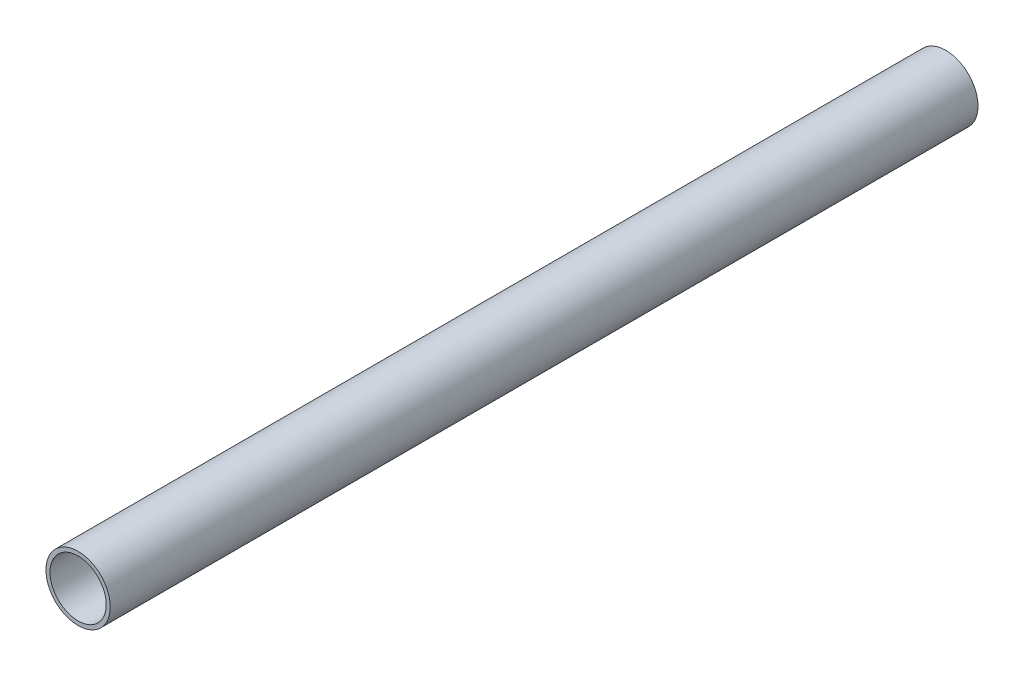
ISO-10303-21;
HEADER;
FILE_DESCRIPTION(('STEP AP214'),'2;1');
FILE_NAME('part.step','',(''),(''),'','','');
FILE_SCHEMA(('AUTOMOTIVE_DESIGN { 1 0 10303 214 1 1 1 1 }'));
ENDSEC;
DATA;
#1=APPLICATION_CONTEXT('core data for automotive mechanical design processes');
#2=APPLICATION_PROTOCOL_DEFINITION('international standard','automotive_design',2000,#1);
#3=PRODUCT_CONTEXT('',#1,'mechanical');
#4=PRODUCT('Part','Part','',(#3));
#5=PRODUCT_RELATED_PRODUCT_CATEGORY('part','',(#4));
#6=PRODUCT_DEFINITION_FORMATION('','',#4);
#7=PRODUCT_DEFINITION_CONTEXT('part definition',#1,'design');
#8=PRODUCT_DEFINITION('design','',#6,#7);
#9=PRODUCT_DEFINITION_SHAPE('','',#8);
#10=(LENGTH_UNIT() NAMED_UNIT(*) SI_UNIT(.MILLI.,.METRE.));
#11=(NAMED_UNIT(*) PLANE_ANGLE_UNIT() SI_UNIT($,.RADIAN.));
#12=(NAMED_UNIT(*) SI_UNIT($,.STERADIAN.) SOLID_ANGLE_UNIT());
#13=UNCERTAINTY_MEASURE_WITH_UNIT(LENGTH_MEASURE(1.E-05),#10,'distance_accuracy_value','');
#14=(GEOMETRIC_REPRESENTATION_CONTEXT(3) GLOBAL_UNCERTAINTY_ASSIGNED_CONTEXT((#13)) GLOBAL_UNIT_ASSIGNED_CONTEXT((#10,
#11,#12)) REPRESENTATION_CONTEXT('',''));
#15=CARTESIAN_POINT('',(0.,0.,0.));
#16=DIRECTION('',(0.,0.,1.));
#17=DIRECTION('',(1.,0.,0.));
#18=AXIS2_PLACEMENT_3D('',#15,#16,#17);
#19=CARTESIAN_POINT('',(0.,0.,342.62));
#20=DIRECTION('',(0.,0.,1.));
#21=DIRECTION('',(1.,0.,0.));
#22=AXIS2_PLACEMENT_3D('',#19,#20,#21);
#23=PLANE('',#22);
#24=CARTESIAN_POINT('',(0.,0.,342.62));
#25=DIRECTION('',(0.,0.,1.));
#26=DIRECTION('',(1.,0.,0.));
#27=AXIS2_PLACEMENT_3D('',#24,#25,#26);
#28=CIRCLE('',#27,12.7);
#29=CARTESIAN_POINT('',(12.7,0.,342.62));
#30=VERTEX_POINT('',#29);
#31=EDGE_CURVE('E10',#30,#30,#28,.T.);
#32=ORIENTED_EDGE('',*,*,#31,.T.);
#33=EDGE_LOOP('',(#32));
#34=FACE_BOUND('',#33,.T.);
#35=CARTESIAN_POINT('',(0.,0.,342.62));
#36=DIRECTION('',(0.,0.,1.));
#37=DIRECTION('',(1.,0.,0.));
#38=AXIS2_PLACEMENT_3D('',#35,#36,#37);
#39=CIRCLE('',#38,11.1125);
#40=CARTESIAN_POINT('',(11.1125,0.,342.62));
#41=VERTEX_POINT('',#40);
#42=EDGE_CURVE('E46',#41,#41,#39,.T.);
#43=ORIENTED_EDGE('',*,*,#42,.F.);
#44=EDGE_LOOP('',(#43));
#45=FACE_BOUND('',#44,.T.);
#46=ADVANCED_FACE('F35',(#34,#45),#23,.T.);
#47=CARTESIAN_POINT('',(0.,0.,0.));
#48=DIRECTION('',(0.,0.,1.));
#49=DIRECTION('',(1.,0.,0.));
#50=AXIS2_PLACEMENT_3D('',#47,#48,#49);
#51=PLANE('',#50);
#52=CARTESIAN_POINT('',(0.,0.,0.));
#53=DIRECTION('',(0.,0.,1.));
#54=DIRECTION('',(1.,0.,0.));
#55=AXIS2_PLACEMENT_3D('',#52,#53,#54);
#56=CIRCLE('',#55,12.7);
#57=CARTESIAN_POINT('',(12.7,0.,0.));
#58=VERTEX_POINT('',#57);
#59=EDGE_CURVE('E39',#58,#58,#56,.T.);
#60=ORIENTED_EDGE('',*,*,#59,.F.);
#61=EDGE_LOOP('',(#60));
#62=FACE_BOUND('',#61,.T.);
#63=CARTESIAN_POINT('',(0.,0.,0.));
#64=DIRECTION('',(0.,0.,1.));
#65=DIRECTION('',(1.,0.,0.));
#66=AXIS2_PLACEMENT_3D('',#63,#64,#65);
#67=CIRCLE('',#66,11.1125);
#68=CARTESIAN_POINT('',(11.1125,0.,0.));
#69=VERTEX_POINT('',#68);
#70=EDGE_CURVE('E48',#69,#69,#67,.T.);
#71=ORIENTED_EDGE('',*,*,#70,.T.);
#72=EDGE_LOOP('',(#71));
#73=FACE_BOUND('',#72,.T.);
#74=ADVANCED_FACE('F58',(#62,#73),#51,.F.);
#75=CARTESIAN_POINT('',(0.,0.,342.62));
#76=DIRECTION('',(0.,0.,-1.));
#77=DIRECTION('',(-1.,0.,0.));
#78=AXIS2_PLACEMENT_3D('',#75,#76,#77);
#79=CYLINDRICAL_SURFACE('',#78,12.7);
#80=ORIENTED_EDGE('',*,*,#31,.F.);
#81=EDGE_LOOP('',(#80));
#82=FACE_BOUND('',#81,.T.);
#83=ORIENTED_EDGE('',*,*,#59,.T.);
#84=EDGE_LOOP('',(#83));
#85=FACE_BOUND('',#84,.T.);
#86=ADVANCED_FACE('F37',(#82,#85),#79,.T.);
#87=CARTESIAN_POINT('',(0.,0.,342.62));
#88=DIRECTION('',(0.,0.,-1.));
#89=DIRECTION('',(-1.,0.,0.));
#90=AXIS2_PLACEMENT_3D('',#87,#88,#89);
#91=CYLINDRICAL_SURFACE('',#90,11.1125);
#92=ORIENTED_EDGE('',*,*,#42,.T.);
#93=EDGE_LOOP('',(#92));
#94=FACE_BOUND('',#93,.T.);
#95=ORIENTED_EDGE('',*,*,#70,.F.);
#96=EDGE_LOOP('',(#95));
#97=FACE_BOUND('',#96,.T.);
#98=ADVANCED_FACE('F54',(#94,#97),#91,.F.);
#99=CLOSED_SHELL('',(#46,#74,#86,#98));
#100=MANIFOLD_SOLID_BREP('B2',#99);
#101=ADVANCED_BREP_SHAPE_REPRESENTATION('',(#18,#100),#14);
#102=SHAPE_DEFINITION_REPRESENTATION(#9,#101);
ENDSEC;
END-ISO-10303-21;
